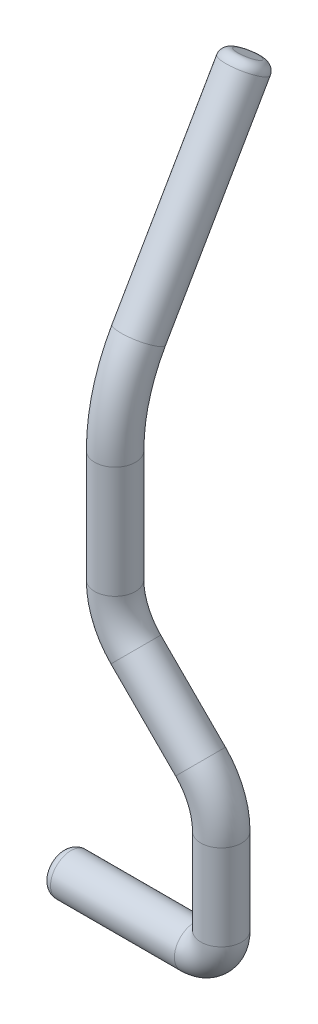
ISO-10303-21;
HEADER;
FILE_DESCRIPTION(('STEP AP214'),'2;1');
FILE_NAME('part.step','',(''),(''),'','','');
FILE_SCHEMA(('AUTOMOTIVE_DESIGN { 1 0 10303 214 1 1 1 1 }'));
ENDSEC;
DATA;
#1=APPLICATION_CONTEXT('core data for automotive mechanical design processes');
#2=APPLICATION_PROTOCOL_DEFINITION('international standard','automotive_design',2000,#1);
#3=PRODUCT_CONTEXT('',#1,'mechanical');
#4=PRODUCT('Part','Part','',(#3));
#5=PRODUCT_RELATED_PRODUCT_CATEGORY('part','',(#4));
#6=PRODUCT_DEFINITION_FORMATION('','',#4);
#7=PRODUCT_DEFINITION_CONTEXT('part definition',#1,'design');
#8=PRODUCT_DEFINITION('design','',#6,#7);
#9=PRODUCT_DEFINITION_SHAPE('','',#8);
#10=(LENGTH_UNIT() NAMED_UNIT(*) SI_UNIT(.MILLI.,.METRE.));
#11=(NAMED_UNIT(*) PLANE_ANGLE_UNIT() SI_UNIT($,.RADIAN.));
#12=(NAMED_UNIT(*) SI_UNIT($,.STERADIAN.) SOLID_ANGLE_UNIT());
#13=UNCERTAINTY_MEASURE_WITH_UNIT(LENGTH_MEASURE(1.E-05),#10,'distance_accuracy_value','');
#14=(GEOMETRIC_REPRESENTATION_CONTEXT(3) GLOBAL_UNCERTAINTY_ASSIGNED_CONTEXT((#13)) GLOBAL_UNIT_ASSIGNED_CONTEXT((#10,
#11,#12)) REPRESENTATION_CONTEXT('',''));
#15=CARTESIAN_POINT('',(0.,0.,0.));
#16=DIRECTION('',(0.,0.,1.));
#17=DIRECTION('',(1.,0.,0.));
#18=AXIS2_PLACEMENT_3D('',#15,#16,#17);
#19=CARTESIAN_POINT('',(-2.99999999999998,0.,0.));
#20=DIRECTION('',(1.,0.,0.));
#21=DIRECTION('',(0.,0.,-1.));
#22=AXIS2_PLACEMENT_3D('',#19,#20,#21);
#23=PLANE('',#22);
#24=CARTESIAN_POINT('',(-2.99999999999998,0.,0.));
#25=DIRECTION('',(1.,0.,0.));
#26=DIRECTION('',(0.,0.,-1.));
#27=AXIS2_PLACEMENT_3D('',#24,#25,#26);
#28=CIRCLE('',#27,0.65);
#29=CARTESIAN_POINT('',(-2.99999999999998,0.,-0.65));
#30=VERTEX_POINT('',#29);
#31=EDGE_CURVE('E10',#30,#30,#28,.F.);
#32=ORIENTED_EDGE('',*,*,#31,.T.);
#33=EDGE_LOOP('',(#32));
#34=FACE_BOUND('',#33,.T.);
#35=ADVANCED_FACE('F31',(#34),#23,.F.);
#36=CARTESIAN_POINT('',(-2.99999999999998,0.,0.));
#37=DIRECTION('',(1.,0.,0.));
#38=DIRECTION('',(0.,1.,0.));
#39=AXIS2_PLACEMENT_3D('',#36,#37,#38);
#40=CYLINDRICAL_SURFACE('',#39,1.15);
#41=CARTESIAN_POINT('',(-2.49999999999998,0.,0.));
#42=DIRECTION('',(1.,0.,0.));
#43=DIRECTION('',(0.,0.,-1.));
#44=AXIS2_PLACEMENT_3D('',#41,#42,#43);
#45=CIRCLE('',#44,1.15);
#46=CARTESIAN_POINT('',(-2.49999999999998,0.,-1.15));
#47=VERTEX_POINT('',#46);
#48=EDGE_CURVE('E38',#47,#47,#45,.T.);
#49=ORIENTED_EDGE('',*,*,#48,.T.);
#50=EDGE_LOOP('',(#49));
#51=FACE_BOUND('',#50,.T.);
#52=CARTESIAN_POINT('',(4.49999999999999,0.,0.));
#53=DIRECTION('',(1.,0.,0.));
#54=DIRECTION('',(0.,0.,-1.));
#55=AXIS2_PLACEMENT_3D('',#52,#53,#54);
#56=CIRCLE('',#55,1.15);
#57=CARTESIAN_POINT('',(4.49999999999998,-1.15000000000003,0.));
#58=VERTEX_POINT('',#57);
#59=EDGE_CURVE('E66',#58,#58,#56,.T.);
#60=ORIENTED_EDGE('',*,*,#59,.F.);
#61=EDGE_LOOP('',(#60));
#62=FACE_BOUND('',#61,.T.);
#63=ADVANCED_FACE('F97',(#51,#62),#40,.T.);
#64=CARTESIAN_POINT('',(4.5,1.5,0.));
#65=DIRECTION('',(0.,0.,1.));
#66=DIRECTION('',(1.,0.,0.));
#67=AXIS2_PLACEMENT_3D('',#64,#65,#66);
#68=TOROIDAL_SURFACE('',#67,1.50000000000003,1.15);
#69=CARTESIAN_POINT('',(6.,1.5,0.));
#70=DIRECTION('',(0.,1.,0.));
#71=DIRECTION('',(0.,0.,-1.));
#72=AXIS2_PLACEMENT_3D('',#69,#70,#71);
#73=CIRCLE('',#72,1.15);
#74=CARTESIAN_POINT('',(7.15000000000003,1.5,0.));
#75=VERTEX_POINT('',#74);
#76=EDGE_CURVE('E63',#75,#75,#73,.T.);
#77=CARTESIAN_POINT('',(4.5,1.5,0.));
#78=DIRECTION('',(0.,0.,1.));
#79=DIRECTION('',(1.,0.,0.));
#80=AXIS2_PLACEMENT_3D('',#77,#78,#79);
#81=CIRCLE('',#80,2.65000000000003);
#82=EDGE_CURVE('',#58,#75,#81,.T.);
#83=ORIENTED_EDGE('',*,*,#59,.T.);
#84=ORIENTED_EDGE('',*,*,#76,.F.);
#85=ORIENTED_EDGE('',*,*,#82,.T.);
#86=ORIENTED_EDGE('',*,*,#82,.F.);
#87=EDGE_LOOP('',(#83,#85,#84,#86));
#88=FACE_BOUND('',#87,.T.);
#89=ADVANCED_FACE('F121',(#88),#68,.T.);
#90=CARTESIAN_POINT('',(6.,1.5,0.));
#91=DIRECTION('',(0.,1.,0.));
#92=DIRECTION('',(-1.,0.,0.));
#93=AXIS2_PLACEMENT_3D('',#90,#91,#92);
#94=CYLINDRICAL_SURFACE('',#93,1.15);
#95=CARTESIAN_POINT('',(6.00000000000001,6.3431457505076,0.));
#96=DIRECTION('',(0.,1.,0.));
#97=DIRECTION('',(0.,0.,-1.));
#98=AXIS2_PLACEMENT_3D('',#95,#96,#97);
#99=CIRCLE('',#98,1.15);
#100=CARTESIAN_POINT('',(7.15000000000001,6.34314575050759,0.));
#101=VERTEX_POINT('',#100);
#102=EDGE_CURVE('E60',#101,#101,#99,.T.);
#103=ORIENTED_EDGE('',*,*,#102,.F.);
#104=EDGE_LOOP('',(#103));
#105=FACE_BOUND('',#104,.T.);
#106=ORIENTED_EDGE('',*,*,#76,.T.);
#107=EDGE_LOOP('',(#106));
#108=FACE_BOUND('',#107,.T.);
#109=ADVANCED_FACE('F124',(#105,#108),#94,.T.);
#110=CARTESIAN_POINT('',(2.,6.34314575050761,0.));
#111=DIRECTION('',(0.,0.,1.));
#112=DIRECTION('',(1.,0.,0.));
#113=AXIS2_PLACEMENT_3D('',#110,#111,#112);
#114=TOROIDAL_SURFACE('',#113,4.00000000000001,1.15);
#115=CARTESIAN_POINT('',(4.8284271247462,9.1715728752538,0.));
#116=DIRECTION('',(-0.707106781186544,0.707106781186551,0.));
#117=DIRECTION('',(0.,0.,-1.));
#118=AXIS2_PLACEMENT_3D('',#115,#116,#117);
#119=CIRCLE('',#118,1.15);
#120=CARTESIAN_POINT('',(5.64159992311073,9.98474567361833,0.));
#121=VERTEX_POINT('',#120);
#122=EDGE_CURVE('E57',#121,#121,#119,.T.);
#123=CARTESIAN_POINT('',(2.,6.34314575050761,0.));
#124=DIRECTION('',(0.,0.,1.));
#125=DIRECTION('',(1.,0.,0.));
#126=AXIS2_PLACEMENT_3D('',#123,#124,#125);
#127=CIRCLE('',#126,5.15000000000001);
#128=EDGE_CURVE('',#101,#121,#127,.T.);
#129=ORIENTED_EDGE('',*,*,#102,.T.);
#130=ORIENTED_EDGE('',*,*,#122,.F.);
#131=ORIENTED_EDGE('',*,*,#128,.T.);
#132=ORIENTED_EDGE('',*,*,#128,.F.);
#133=EDGE_LOOP('',(#129,#131,#130,#132));
#134=FACE_BOUND('',#133,.T.);
#135=ADVANCED_FACE('F128',(#134),#114,.T.);
#136=CARTESIAN_POINT('',(4.8284271247462,9.17157287525379,0.));
#137=DIRECTION('',(-0.70710678118655,0.707106781186545,0.));
#138=DIRECTION('',(-0.707106781186545,-0.70710678118655,0.));
#139=AXIS2_PLACEMENT_3D('',#136,#137,#138);
#140=CYLINDRICAL_SURFACE('',#139,1.15);
#141=CARTESIAN_POINT('',(1.17157287525381,12.8284271247461,0.));
#142=DIRECTION('',(-0.707106781186548,0.707106781186547,0.));
#143=DIRECTION('',(0.,0.,-1.));
#144=AXIS2_PLACEMENT_3D('',#141,#142,#143);
#145=CIRCLE('',#144,1.15);
#146=CARTESIAN_POINT('',(0.358400076889288,12.0152543263816,0.));
#147=VERTEX_POINT('',#146);
#148=EDGE_CURVE('E54',#147,#147,#145,.T.);
#149=ORIENTED_EDGE('',*,*,#148,.F.);
#150=EDGE_LOOP('',(#149));
#151=FACE_BOUND('',#150,.T.);
#152=ORIENTED_EDGE('',*,*,#122,.T.);
#153=EDGE_LOOP('',(#152));
#154=FACE_BOUND('',#153,.T.);
#155=ADVANCED_FACE('F91',(#151,#154),#140,.T.);
#156=CARTESIAN_POINT('',(4.,15.6568542494924,0.));
#157=DIRECTION('',(0.,0.,-1.));
#158=DIRECTION('',(-1.,0.,0.));
#159=AXIS2_PLACEMENT_3D('',#156,#157,#158);
#160=TOROIDAL_SURFACE('',#159,4.,1.15);
#161=CARTESIAN_POINT('',(0.,15.6568542494924,0.));
#162=DIRECTION('',(0.,1.,0.));
#163=DIRECTION('',(0.,0.,-1.));
#164=AXIS2_PLACEMENT_3D('',#161,#162,#163);
#165=CIRCLE('',#164,1.15);
#166=CARTESIAN_POINT('',(-1.15000000000001,15.6568542494924,0.));
#167=VERTEX_POINT('',#166);
#168=EDGE_CURVE('E51',#167,#167,#165,.T.);
#169=CARTESIAN_POINT('',(4.,15.6568542494924,0.));
#170=DIRECTION('',(0.,0.,-1.));
#171=DIRECTION('',(-1.,0.,0.));
#172=AXIS2_PLACEMENT_3D('',#169,#170,#171);
#173=CIRCLE('',#172,5.15);
#174=EDGE_CURVE('',#147,#167,#173,.T.);
#175=ORIENTED_EDGE('',*,*,#148,.T.);
#176=ORIENTED_EDGE('',*,*,#168,.F.);
#177=ORIENTED_EDGE('',*,*,#174,.T.);
#178=ORIENTED_EDGE('',*,*,#174,.F.);
#179=EDGE_LOOP('',(#175,#177,#176,#178));
#180=FACE_BOUND('',#179,.T.);
#181=ADVANCED_FACE('F81',(#180),#160,.T.);
#182=CARTESIAN_POINT('',(0.,15.6568542494924,0.));
#183=DIRECTION('',(0.,1.,0.));
#184=DIRECTION('',(0.,0.,1.));
#185=AXIS2_PLACEMENT_3D('',#182,#183,#184);
#186=CYLINDRICAL_SURFACE('',#185,1.15);
#187=ORIENTED_EDGE('',*,*,#168,.T.);
#188=EDGE_LOOP('',(#187));
#189=FACE_BOUND('',#188,.T.);
#190=CARTESIAN_POINT('',(0.,21.9773623251811,0.));
#191=DIRECTION('',(0.,1.,0.));
#192=DIRECTION('',(-1.,0.,0.));
#193=AXIS2_PLACEMENT_3D('',#190,#191,#192);
#194=CIRCLE('',#193,1.15);
#195=CARTESIAN_POINT('',(0.,21.9773623251811,1.14999999999993));
#196=VERTEX_POINT('',#195);
#197=EDGE_CURVE('E72',#196,#196,#194,.T.);
#198=ORIENTED_EDGE('',*,*,#197,.F.);
#199=EDGE_LOOP('',(#198));
#200=FACE_BOUND('',#199,.T.);
#201=ADVANCED_FACE('F78',(#189,#200),#186,.T.);
#202=CARTESIAN_POINT('',(0.,37.6472353062589,-7.50000000000001));
#203=DIRECTION('',(0.,0.866025403784438,-0.500000000000001));
#204=DIRECTION('',(-1.,0.,0.));
#205=AXIS2_PLACEMENT_3D('',#202,#203,#204);
#206=PLANE('',#205);
#207=CARTESIAN_POINT('',(0.,37.6472353062589,-7.50000000000001));
#208=DIRECTION('',(0.,0.866025403784438,-0.500000000000001));
#209=DIRECTION('',(0.,0.500000000000001,0.866025403784438));
#210=AXIS2_PLACEMENT_3D('',#207,#208,#209);
#211=CIRCLE('',#210,0.65);
#212=CARTESIAN_POINT('',(0.,37.9722353062589,-6.93708348754013));
#213=VERTEX_POINT('',#212);
#214=EDGE_CURVE('E46',#213,#213,#211,.T.);
#215=ORIENTED_EDGE('',*,*,#214,.T.);
#216=EDGE_LOOP('',(#215));
#217=FACE_BOUND('',#216,.T.);
#218=ADVANCED_FACE('F80',(#217),#206,.T.);
#219=CARTESIAN_POINT('',(0.,21.9773623251811,-10.));
#220=DIRECTION('',(-1.,0.,0.));
#221=DIRECTION('',(0.,0.,1.));
#222=AXIS2_PLACEMENT_3D('',#219,#220,#221);
#223=TOROIDAL_SURFACE('',#222,9.99999999999993,1.15);
#224=CARTESIAN_POINT('',(0.,26.9773623251812,-1.33974596215564));
#225=DIRECTION('',(0.,0.866025403784436,-0.500000000000005));
#226=DIRECTION('',(-1.,0.,0.));
#227=AXIS2_PLACEMENT_3D('',#224,#225,#226);
#228=CIRCLE('',#227,1.15);
#229=CARTESIAN_POINT('',(0.,27.5523623251811,-0.343816747803602));
#230=VERTEX_POINT('',#229);
#231=EDGE_CURVE('E69',#230,#230,#228,.T.);
#232=CARTESIAN_POINT('',(0.,21.9773623251811,-10.));
#233=DIRECTION('',(-1.,0.,0.));
#234=DIRECTION('',(0.,0.,1.));
#235=AXIS2_PLACEMENT_3D('',#232,#233,#234);
#236=CIRCLE('',#235,11.1499999999999);
#237=EDGE_CURVE('',#196,#230,#236,.T.);
#238=ORIENTED_EDGE('',*,*,#197,.T.);
#239=ORIENTED_EDGE('',*,*,#231,.F.);
#240=ORIENTED_EDGE('',*,*,#237,.T.);
#241=ORIENTED_EDGE('',*,*,#237,.F.);
#242=EDGE_LOOP('',(#238,#240,#239,#241));
#243=FACE_BOUND('',#242,.T.);
#244=ADVANCED_FACE('F76',(#243),#223,.T.);
#245=CARTESIAN_POINT('',(0.,26.9773623251812,-1.33974596215564));
#246=DIRECTION('',(0.,0.866025403784438,-0.500000000000001));
#247=DIRECTION('',(0.,0.500000000000001,0.866025403784438));
#248=AXIS2_PLACEMENT_3D('',#245,#246,#247);
#249=CYLINDRICAL_SURFACE('',#248,1.15);
#250=CARTESIAN_POINT('',(0.,37.2142226043667,-7.25000000000001));
#251=DIRECTION('',(0.,0.866025403784438,-0.500000000000001));
#252=DIRECTION('',(0.,0.500000000000001,0.866025403784438));
#253=AXIS2_PLACEMENT_3D('',#250,#251,#252);
#254=CIRCLE('',#253,1.15);
#255=CARTESIAN_POINT('',(0.,37.7892226043667,-6.25407078564791));
#256=VERTEX_POINT('',#255);
#257=EDGE_CURVE('E42',#256,#256,#254,.F.);
#258=ORIENTED_EDGE('',*,*,#257,.T.);
#259=EDGE_LOOP('',(#258));
#260=FACE_BOUND('',#259,.T.);
#261=ORIENTED_EDGE('',*,*,#231,.T.);
#262=EDGE_LOOP('',(#261));
#263=FACE_BOUND('',#262,.T.);
#264=ADVANCED_FACE('F98',(#260,#263),#249,.T.);
#265=CARTESIAN_POINT('',(0.,37.2142226043667,-7.25000000000001));
#266=DIRECTION('',(0.,0.866025403784438,-0.500000000000001));
#267=DIRECTION('',(0.,0.500000000000001,0.866025403784438));
#268=AXIS2_PLACEMENT_3D('',#265,#266,#267);
#269=TOROIDAL_SURFACE('',#268,0.65,0.5);
#270=ORIENTED_EDGE('',*,*,#257,.F.);
#271=EDGE_LOOP('',(#270));
#272=FACE_BOUND('',#271,.T.);
#273=ORIENTED_EDGE('',*,*,#214,.F.);
#274=EDGE_LOOP('',(#273));
#275=FACE_BOUND('',#274,.T.);
#276=ADVANCED_FACE('F90',(#272,#275),#269,.T.);
#277=CARTESIAN_POINT('',(-2.49999999999998,0.,0.));
#278=DIRECTION('',(1.,0.,0.));
#279=DIRECTION('',(0.,0.,-1.));
#280=AXIS2_PLACEMENT_3D('',#277,#278,#279);
#281=TOROIDAL_SURFACE('',#280,0.65,0.5);
#282=ORIENTED_EDGE('',*,*,#31,.F.);
#283=EDGE_LOOP('',(#282));
#284=FACE_BOUND('',#283,.T.);
#285=ORIENTED_EDGE('',*,*,#48,.F.);
#286=EDGE_LOOP('',(#285));
#287=FACE_BOUND('',#286,.T.);
#288=ADVANCED_FACE('F33',(#284,#287),#281,.T.);
#289=CLOSED_SHELL('',(#35,#63,#89,#109,#135,#155,#181,#201,#218,#244,#264,#276,#288));
#290=MANIFOLD_SOLID_BREP('B2',#289);
#291=ADVANCED_BREP_SHAPE_REPRESENTATION('',(#18,#290),#14);
#292=SHAPE_DEFINITION_REPRESENTATION(#9,#291);
ENDSEC;
END-ISO-10303-21;
